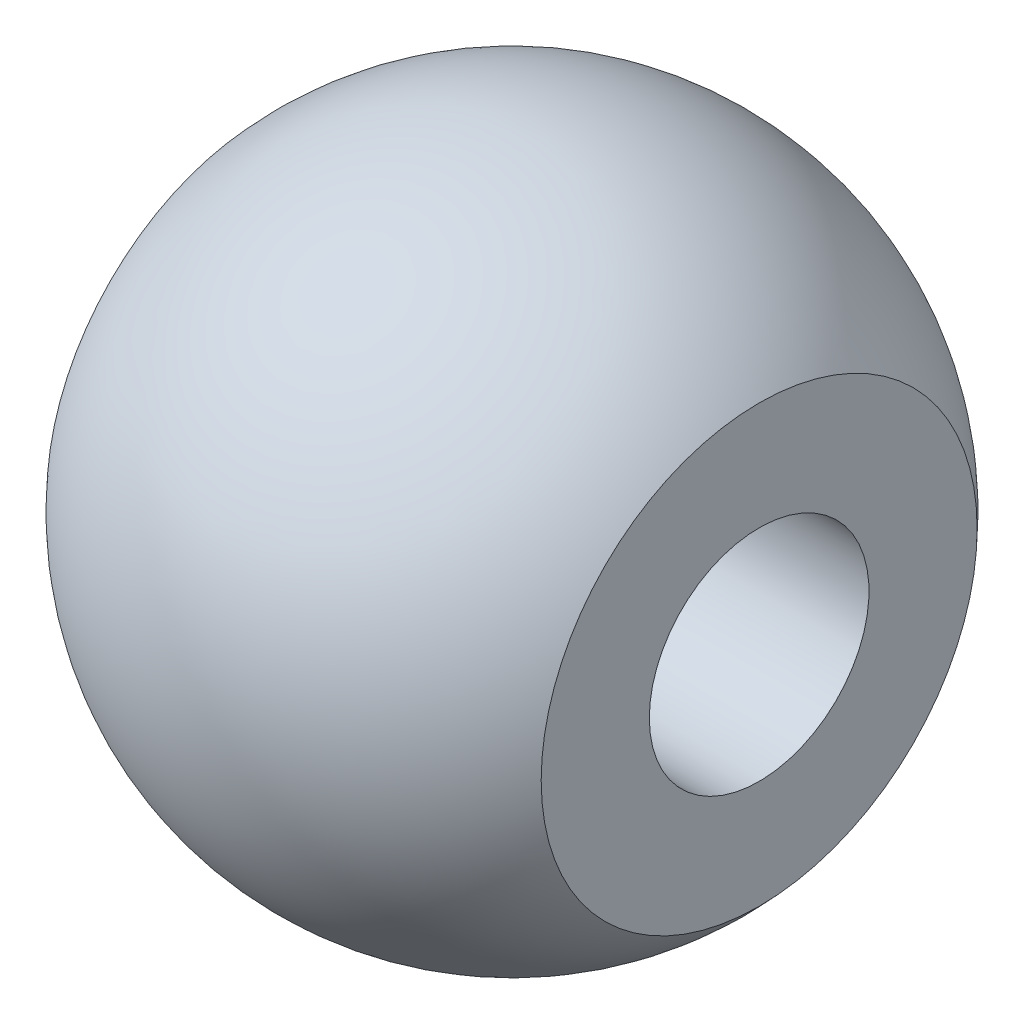
ISO-10303-21;
HEADER;
FILE_DESCRIPTION(('STEP AP214'),'2;1');
FILE_NAME('part.step','',(''),(''),'','','');
FILE_SCHEMA(('AUTOMOTIVE_DESIGN { 1 0 10303 214 1 1 1 1 }'));
ENDSEC;
DATA;
#1=APPLICATION_CONTEXT('core data for automotive mechanical design processes');
#2=APPLICATION_PROTOCOL_DEFINITION('international standard','automotive_design',2000,#1);
#3=PRODUCT_CONTEXT('',#1,'mechanical');
#4=PRODUCT('Part','Part','',(#3));
#5=PRODUCT_RELATED_PRODUCT_CATEGORY('part','',(#4));
#6=PRODUCT_DEFINITION_FORMATION('','',#4);
#7=PRODUCT_DEFINITION_CONTEXT('part definition',#1,'design');
#8=PRODUCT_DEFINITION('design','',#6,#7);
#9=PRODUCT_DEFINITION_SHAPE('','',#8);
#10=(LENGTH_UNIT() NAMED_UNIT(*) SI_UNIT(.MILLI.,.METRE.));
#11=(NAMED_UNIT(*) PLANE_ANGLE_UNIT() SI_UNIT($,.RADIAN.));
#12=(NAMED_UNIT(*) SI_UNIT($,.STERADIAN.) SOLID_ANGLE_UNIT());
#13=UNCERTAINTY_MEASURE_WITH_UNIT(LENGTH_MEASURE(1.E-05),#10,'distance_accuracy_value','');
#14=(GEOMETRIC_REPRESENTATION_CONTEXT(3) GLOBAL_UNCERTAINTY_ASSIGNED_CONTEXT((#13)) GLOBAL_UNIT_ASSIGNED_CONTEXT((#10,
#11,#12)) REPRESENTATION_CONTEXT('',''));
#15=CARTESIAN_POINT('',(0.,0.,0.));
#16=DIRECTION('',(0.,0.,1.));
#17=DIRECTION('',(1.,0.,0.));
#18=AXIS2_PLACEMENT_3D('',#15,#16,#17);
#19=CARTESIAN_POINT('',(-4.5,0.,0.));
#20=DIRECTION('',(-1.,0.,0.));
#21=DIRECTION('',(0.,0.,1.));
#22=AXIS2_PLACEMENT_3D('',#19,#20,#21);
#23=CONICAL_SURFACE('',#22,3.00000000000001,0.785398163397454);
#24=CARTESIAN_POINT('',(-3.5,0.,0.));
#25=DIRECTION('',(-1.,0.,0.));
#26=DIRECTION('',(0.,0.,1.));
#27=AXIS2_PLACEMENT_3D('',#24,#25,#26);
#28=CIRCLE('',#27,2.);
#29=CARTESIAN_POINT('',(-3.5,0.,2.));
#30=VERTEX_POINT('',#29);
#31=EDGE_CURVE('E54',#30,#30,#28,.T.);
#32=ORIENTED_EDGE('',*,*,#31,.F.);
#33=EDGE_LOOP('',(#32));
#34=FACE_BOUND('',#33,.T.);
#35=CARTESIAN_POINT('',(-4.5,0.,0.));
#36=DIRECTION('',(1.,0.,0.));
#37=DIRECTION('',(0.,0.,-1.));
#38=AXIS2_PLACEMENT_3D('',#35,#36,#37);
#39=CIRCLE('',#38,3.00000000000001);
#40=CARTESIAN_POINT('',(-4.5,0.,-3.00000000000001));
#41=VERTEX_POINT('',#40);
#42=EDGE_CURVE('E10',#41,#41,#39,.T.);
#43=ORIENTED_EDGE('',*,*,#42,.F.);
#44=EDGE_LOOP('',(#43));
#45=FACE_BOUND('',#44,.T.);
#46=ADVANCED_FACE('F37',(#34,#45),#23,.F.);
#47=CARTESIAN_POINT('',(-4.5,3.96862696659689,0.));
#48=DIRECTION('',(-1.,0.,0.));
#49=DIRECTION('',(0.,0.,1.));
#50=AXIS2_PLACEMENT_3D('',#47,#48,#49);
#51=PLANE('',#50);
#52=ORIENTED_EDGE('',*,*,#42,.T.);
#53=EDGE_LOOP('',(#52));
#54=FACE_BOUND('',#53,.T.);
#55=CARTESIAN_POINT('',(-4.5,0.,0.));
#56=DIRECTION('',(1.,0.,0.));
#57=DIRECTION('',(0.,0.,-1.));
#58=AXIS2_PLACEMENT_3D('',#55,#56,#57);
#59=CIRCLE('',#58,3.96862696659688);
#60=CARTESIAN_POINT('',(-4.5,3.96862696659688,0.));
#61=VERTEX_POINT('',#60);
#62=EDGE_CURVE('E43',#61,#61,#59,.T.);
#63=ORIENTED_EDGE('',*,*,#62,.F.);
#64=EDGE_LOOP('',(#63));
#65=FACE_BOUND('',#64,.T.);
#66=ADVANCED_FACE('F71',(#54,#65),#51,.T.);
#67=CARTESIAN_POINT('',(0.,0.,0.));
#68=DIRECTION('',(1.,0.,0.));
#69=DIRECTION('',(0.,1.,0.));
#70=AXIS2_PLACEMENT_3D('',#67,#68,#69);
#71=SPHERICAL_SURFACE('',#70,6.);
#72=CARTESIAN_POINT('',(4.5,1.0547118733939E-12,3.19189119579733E-13));
#73=DIRECTION('',(1.,0.,0.));
#74=DIRECTION('',(0.,0.,-1.));
#75=AXIS2_PLACEMENT_3D('',#72,#73,#74);
#76=CIRCLE('',#75,3.96862696659689);
#77=CARTESIAN_POINT('',(4.5,3.96862696659688,0.));
#78=VERTEX_POINT('',#77);
#79=EDGE_CURVE('E47',#78,#78,#76,.T.);
#80=CARTESIAN_POINT('',(-4.5,3.96862696659688,0.));
#81=CARTESIAN_POINT('',(-4.42988448417368,4.048134767807,0.));
#82=CARTESIAN_POINT('',(-4.35765791170533,4.12578044526496,0.));
#83=CARTESIAN_POINT('',(-4.20919440386366,4.27713817883406,0.));
#84=CARTESIAN_POINT('',(-4.13295746849035,4.3508502349452,0.));
#85=CARTESIAN_POINT('',(-3.97668498521783,4.4941313519782,0.));
#86=CARTESIAN_POINT('',(-3.89664943731863,4.56370041290004,0.));
#87=CARTESIAN_POINT('',(-3.73300516695229,4.69850076282096,0.));
#88=CARTESIAN_POINT('',(-3.64939644448516,4.76373205182002,0.));
#89=CARTESIAN_POINT('',(-3.47884049038039,4.88967347164259,0.));
#90=CARTESIAN_POINT('',(-3.39189325874276,4.95038360246609,0.));
#91=CARTESIAN_POINT('',(-3.21490454544202,5.06711223105533,0.));
#92=CARTESIAN_POINT('',(-3.1248630637789,5.12313072882107,0.));
#93=CARTESIAN_POINT('',(-2.94193874249416,5.23031873710099,0.));
#94=CARTESIAN_POINT('',(-2.84905590287252,5.28148824761516,0.));
#95=CARTESIAN_POINT('',(-2.66070975397033,5.37883456206912,0.));
#96=CARTESIAN_POINT('',(-2.56524644468977,5.4250113660089,0.));
#97=CARTESIAN_POINT('',(-2.37200748850401,5.51224256718486,0.));
#98=CARTESIAN_POINT('',(-2.27423184159882,5.55329696442104,0.));
#99=CARTESIAN_POINT('',(-2.07664283810176,5.63016804073458,0.));
#100=CARTESIAN_POINT('',(-1.97682948150991,5.66598471981195,0.));
#101=CARTESIAN_POINT('',(-1.77544540970266,5.73227975951891,0.));
#102=CARTESIAN_POINT('',(-1.67387469448727,5.76275812014852,0.));
#103=CARTESIAN_POINT('',(-1.46926119256368,5.81829091677091,0.));
#104=CARTESIAN_POINT('',(-1.36621840585548,5.8433453527637,0.));
#105=CARTESIAN_POINT('',(-1.15895018274161,5.8879599283703,0.));
#106=CARTESIAN_POINT('',(-1.05472474633594,5.90752006798411,0.));
#107=CARTESIAN_POINT('',(-0.845383967399884,5.94109111122104,0.));
#108=CARTESIAN_POINT('',(-0.74026862486949,5.95510201484416,0.));
#109=CARTESIAN_POINT('',(-0.529443276782207,5.97753523292316,0.));
#110=CARTESIAN_POINT('',(-0.423733271225319,5.98595754737904,0.));
#111=CARTESIAN_POINT('',(-0.21201551044562,5.99718993091746,0.));
#112=CARTESIAN_POINT('',(-0.10600775522281,6.,0.));
#113=CARTESIAN_POINT('',(0.106007755222809,6.,0.));
#114=CARTESIAN_POINT('',(0.212015510445619,5.99718993091746,0.));
#115=CARTESIAN_POINT('',(0.423733271225317,5.98595754737904,0.));
#116=CARTESIAN_POINT('',(0.529443276782206,5.97753523292316,0.));
#117=CARTESIAN_POINT('',(0.740268624869489,5.95510201484416,0.));
#118=CARTESIAN_POINT('',(0.845383967399883,5.94109111122104,0.));
#119=CARTESIAN_POINT('',(1.05472474633594,5.90752006798411,0.));
#120=CARTESIAN_POINT('',(1.15895018274161,5.8879599283703,0.));
#121=CARTESIAN_POINT('',(1.36621840585548,5.8433453527637,0.));
#122=CARTESIAN_POINT('',(1.46926119256368,5.81829091677091,0.));
#123=CARTESIAN_POINT('',(1.67387469448727,5.76275812014852,0.));
#124=CARTESIAN_POINT('',(1.77544540970266,5.73227975951892,0.));
#125=CARTESIAN_POINT('',(1.97682948150991,5.66598471981195,0.));
#126=CARTESIAN_POINT('',(2.07664283810176,5.63016804073458,0.));
#127=CARTESIAN_POINT('',(2.27423184159881,5.55329696442104,0.));
#128=CARTESIAN_POINT('',(2.37200748850401,5.51224256718486,0.));
#129=CARTESIAN_POINT('',(2.56524644468977,5.42501136600891,0.));
#130=CARTESIAN_POINT('',(2.66070975397032,5.37883456206912,0.));
#131=CARTESIAN_POINT('',(2.84905590287252,5.28148824761517,0.));
#132=CARTESIAN_POINT('',(2.94193874249416,5.23031873710099,0.));
#133=CARTESIAN_POINT('',(3.1248630637789,5.12313072882108,0.));
#134=CARTESIAN_POINT('',(3.21490454544201,5.06711223105534,0.));
#135=CARTESIAN_POINT('',(3.39189325874276,4.95038360246609,0.));
#136=CARTESIAN_POINT('',(3.47884049038039,4.88967347164259,0.));
#137=CARTESIAN_POINT('',(3.64939644448516,4.76373205182003,0.));
#138=CARTESIAN_POINT('',(3.73300516695229,4.69850076282096,0.));
#139=CARTESIAN_POINT('',(3.89664943731863,4.56370041290005,0.));
#140=CARTESIAN_POINT('',(3.97668498521783,4.4941313519782,0.));
#141=CARTESIAN_POINT('',(4.13295746849035,4.3508502349452,0.));
#142=CARTESIAN_POINT('',(4.20919440386366,4.27713817883406,0.));
#143=CARTESIAN_POINT('',(4.35765791170533,4.12578044526496,0.));
#144=CARTESIAN_POINT('',(4.42988448417368,4.048134767807,0.));
#145=CARTESIAN_POINT('',(4.5,3.96862696659688,0.));
#146=B_SPLINE_CURVE_WITH_KNOTS('',3,(#80,#81,#82,#83,#84,#85,#86,#87,#88,#89,#90,#91,#92,#93,
#94,#95,#96,#97,#98,#99,#100,#101,#102,#103,#104,#105,#106,#107,#108,#109,#110,#111,#112,#113,
#114,#115,#116,#117,#118,#119,#120,#121,#122,#123,#124,#125,#126,#127,#128,#129,#130,#131,#132,
#133,#134,#135,#136,#137,#138,#139,#140,#141,#142,#143,#144,#145),.UNSPECIFIED.,.F.,.F.,(4,2,2,
2,2,2,2,2,2,2,2,2,2,2,2,2,2,2,2,2,2,2,2,2,2,2,2,2,2,2,2,2,4),(0.,0.317986053500719,
0.635972107001438,0.953958160502157,1.27194421400288,1.5899302675036,1.90791632100431,
2.22590237450503,2.54388842800575,2.86187448150647,3.17986053500719,3.49784658850791,
3.81583264200863,4.13381869550935,4.45180474901007,4.76979080251079,5.0877768560115,
5.40576290951222,5.72374896301294,6.04173501651366,6.35972107001438,6.6777071235151,
6.99569317701582,7.31367923051654,7.63166528401726,7.94965133751798,8.2676373910187,
8.58562344451942,8.90360949802013,9.22159555152085,9.53958160502157,9.85756765852229,
10.175553712023),.UNSPECIFIED.);
#147=EDGE_CURVE('BSEAM75',#61,#78,#146,.T.);
#148=ORIENTED_EDGE('',*,*,#62,.T.);
#149=ORIENTED_EDGE('',*,*,#79,.F.);
#150=ORIENTED_EDGE('',*,*,#147,.T.);
#151=ORIENTED_EDGE('',*,*,#147,.F.);
#152=EDGE_LOOP('',(#148,#150,#149,#151));
#153=FACE_BOUND('',#152,.T.);
#154=ADVANCED_FACE('F75',(#153),#71,.T.);
#155=CARTESIAN_POINT('',(4.5,3.96862696659786,3.46944695195361E-13));
#156=DIRECTION('',(1.,0.,0.));
#157=DIRECTION('',(0.,0.,-1.));
#158=AXIS2_PLACEMENT_3D('',#155,#156,#157);
#159=PLANE('',#158);
#160=CARTESIAN_POINT('',(4.5,1.0547118733939E-12,3.19189119579733E-13));
#161=DIRECTION('',(-1.,0.,0.));
#162=DIRECTION('',(0.,0.,1.));
#163=AXIS2_PLACEMENT_3D('',#160,#161,#162);
#164=CIRCLE('',#163,2.);
#165=CARTESIAN_POINT('',(4.5,1.0547118733939E-12,2.00000000000032));
#166=VERTEX_POINT('',#165);
#167=EDGE_CURVE('E51',#166,#166,#164,.T.);
#168=ORIENTED_EDGE('',*,*,#167,.T.);
#169=EDGE_LOOP('',(#168));
#170=FACE_BOUND('',#169,.T.);
#171=ORIENTED_EDGE('',*,*,#79,.T.);
#172=EDGE_LOOP('',(#171));
#173=FACE_BOUND('',#172,.T.);
#174=ADVANCED_FACE('F60',(#170,#173),#159,.T.);
#175=CARTESIAN_POINT('',(4.5,1.0547118733939E-12,3.19189119579733E-13));
#176=DIRECTION('',(-1.,0.,0.));
#177=DIRECTION('',(0.,0.,1.));
#178=AXIS2_PLACEMENT_3D('',#175,#176,#177);
#179=CYLINDRICAL_SURFACE('',#178,2.);
#180=ORIENTED_EDGE('',*,*,#167,.F.);
#181=EDGE_LOOP('',(#180));
#182=FACE_BOUND('',#181,.T.);
#183=ORIENTED_EDGE('',*,*,#31,.T.);
#184=EDGE_LOOP('',(#183));
#185=FACE_BOUND('',#184,.T.);
#186=ADVANCED_FACE('F63',(#182,#185),#179,.F.);
#187=CLOSED_SHELL('',(#46,#66,#154,#174,#186));
#188=MANIFOLD_SOLID_BREP('B2',#187);
#189=ADVANCED_BREP_SHAPE_REPRESENTATION('',(#18,#188),#14);
#190=SHAPE_DEFINITION_REPRESENTATION(#9,#189);
ENDSEC;
END-ISO-10303-21;
